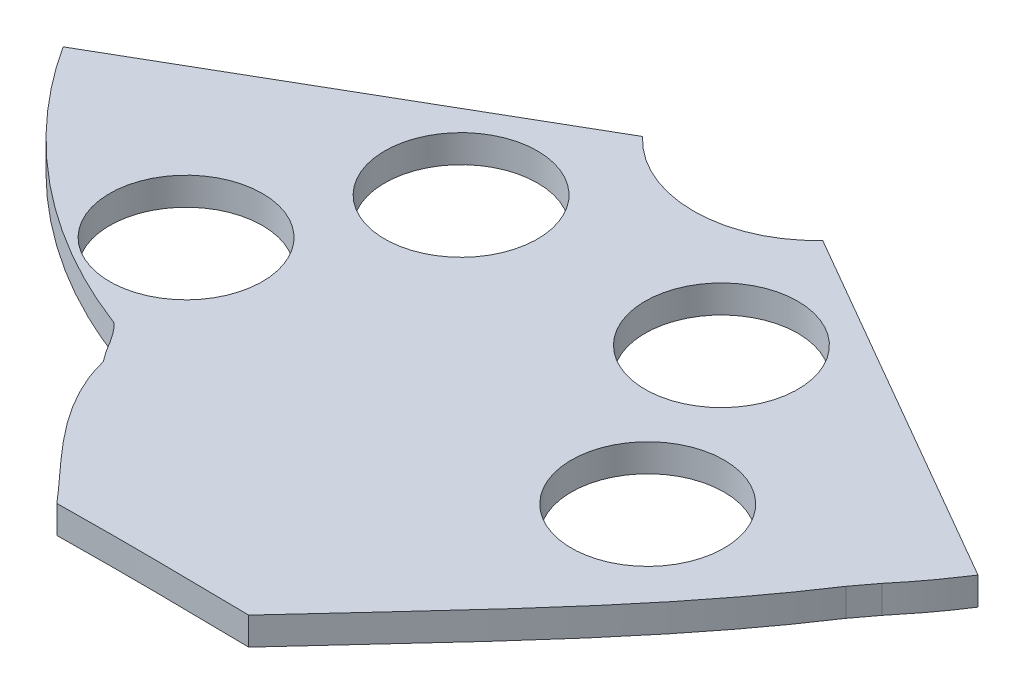
ISO-10303-21;
HEADER;
FILE_DESCRIPTION(('STEP AP214'),'2;1');
FILE_NAME('part.step','',(''),(''),'','','');
FILE_SCHEMA(('AUTOMOTIVE_DESIGN { 1 0 10303 214 1 1 1 1 }'));
ENDSEC;
DATA;
#1=APPLICATION_CONTEXT('core data for automotive mechanical design processes');
#2=APPLICATION_PROTOCOL_DEFINITION('international standard','automotive_design',2000,#1);
#3=PRODUCT_CONTEXT('',#1,'mechanical');
#4=PRODUCT('Part','Part','',(#3));
#5=PRODUCT_RELATED_PRODUCT_CATEGORY('part','',(#4));
#6=PRODUCT_DEFINITION_FORMATION('','',#4);
#7=PRODUCT_DEFINITION_CONTEXT('part definition',#1,'design');
#8=PRODUCT_DEFINITION('design','',#6,#7);
#9=PRODUCT_DEFINITION_SHAPE('','',#8);
#10=(LENGTH_UNIT() NAMED_UNIT(*) SI_UNIT(.MILLI.,.METRE.));
#11=(NAMED_UNIT(*) PLANE_ANGLE_UNIT() SI_UNIT($,.RADIAN.));
#12=(NAMED_UNIT(*) SI_UNIT($,.STERADIAN.) SOLID_ANGLE_UNIT());
#13=UNCERTAINTY_MEASURE_WITH_UNIT(LENGTH_MEASURE(1.E-05),#10,'distance_accuracy_value','');
#14=(GEOMETRIC_REPRESENTATION_CONTEXT(3) GLOBAL_UNCERTAINTY_ASSIGNED_CONTEXT((#13)) GLOBAL_UNIT_ASSIGNED_CONTEXT((#10,
#11,#12)) REPRESENTATION_CONTEXT('',''));
#15=CARTESIAN_POINT('',(0.,0.,0.));
#16=DIRECTION('',(0.,0.,1.));
#17=DIRECTION('',(1.,0.,0.));
#18=AXIS2_PLACEMENT_3D('',#15,#16,#17);
#19=CARTESIAN_POINT('',(-49.3251559306499,-75.736,61.0681336845495));
#20=DIRECTION('',(0.,-1.,0.));
#21=DIRECTION('',(0.,0.,-1.));
#22=AXIS2_PLACEMENT_3D('',#19,#20,#21);
#23=PLANE('',#22);
#24=CARTESIAN_POINT('',(18.75,-75.736,32.476));
#25=DIRECTION('',(0.,-1.,0.));
#26=DIRECTION('',(0.,0.,-1.));
#27=AXIS2_PLACEMENT_3D('',#24,#25,#26);
#28=CIRCLE('',#27,10.999845998306);
#29=CARTESIAN_POINT('',(18.75,-75.736,21.476154001694));
#30=VERTEX_POINT('',#29);
#31=EDGE_CURVE('E441',#30,#30,#28,.T.);
#32=ORIENTED_EDGE('',*,*,#31,.F.);
#33=EDGE_LOOP('',(#32));
#34=FACE_BOUND('',#33,.T.);
#35=CARTESIAN_POINT('',(-33.25,-75.736,57.591));
#36=DIRECTION('',(0.,-1.,0.));
#37=DIRECTION('',(0.,0.,-1.));
#38=AXIS2_PLACEMENT_3D('',#35,#36,#37);
#39=CIRCLE('',#38,10.999845998306);
#40=CARTESIAN_POINT('',(-33.25,-75.736,46.591154001694));
#41=VERTEX_POINT('',#40);
#42=EDGE_CURVE('E422',#41,#41,#39,.T.);
#43=ORIENTED_EDGE('',*,*,#42,.F.);
#44=EDGE_LOOP('',(#43));
#45=FACE_BOUND('',#44,.T.);
#46=CARTESIAN_POINT('',(-65.8942438215736,-75.736,42.6629141284688));
#47=CARTESIAN_POINT('',(-64.767422520505,-75.736,44.4027044600755));
#48=CARTESIAN_POINT('',(-63.5718643621077,-75.736,46.0988940940524));
#49=CARTESIAN_POINT('',(-61.0521689051536,-75.736,49.3887324797404));
#50=CARTESIAN_POINT('',(-59.727008374736,-75.736,50.9829329409589));
#51=CARTESIAN_POINT('',(-55.5665444443822,-75.736,55.6031367626288));
#52=CARTESIAN_POINT('',(-52.5489505867435,-75.736,58.464282038792));
#53=CARTESIAN_POINT('',(-46.1013612745563,-75.736,63.6719853303069));
#54=CARTESIAN_POINT('',(-42.6694563621279,-75.736,66.0207583018738));
#55=CARTESIAN_POINT('',(-35.4806077264138,-75.736,70.1471588010179));
#56=CARTESIAN_POINT('',(-31.7213398313859,-75.736,71.9243112594398));
#57=CARTESIAN_POINT('',(-27.8465665988509,-75.736,73.3950244209968));
#58=B_SPLINE_CURVE_WITH_KNOTS('',3,(#46,#47,#48,#49,#50,#51,#52,#53,#54,#55,#56,#57),
.UNSPECIFIED.,.F.,.F.,(4,2,2,2,2,4),(1.37053743953786E-06,0.12500137053744,0.25000137053744,
0.50000137053744,0.75000137053744,1.),.UNSPECIFIED.);
#59=CARTESIAN_POINT('',(-27.8465665942544,-75.736,73.3950244088874));
#60=VERTEX_POINT('',#59);
#61=CARTESIAN_POINT('',(-65.8942438215736,-75.736,42.6629141284688));
#62=VERTEX_POINT('',#61);
#63=EDGE_CURVE('E378',#60,#62,#58,.F.);
#64=ORIENTED_EDGE('',*,*,#63,.T.);
#65=DIRECTION('',(0.866025113443952,0.,-0.500000502884138));
#66=VECTOR('',#65,1.);
#67=CARTESIAN_POINT('',(-65.8942438215736,-75.736,42.6629141284688));
#68=LINE('',#67,#66);
#69=CARTESIAN_POINT('',(-12.9766531358799,-75.736,12.1108879302399));
#70=VERTEX_POINT('',#69);
#71=EDGE_CURVE('E103',#62,#70,#68,.T.);
#72=ORIENTED_EDGE('',*,*,#71,.T.);
#73=CARTESIAN_POINT('',(0.,-75.736,0.));
#74=DIRECTION('',(0.,1.,0.));
#75=DIRECTION('',(0.,0.,-1.));
#76=AXIS2_PLACEMENT_3D('',#73,#74,#75);
#77=CIRCLE('',#76,17.7501305084715);
#78=CARTESIAN_POINT('',(12.9766531358511,-75.736,12.1108879302707));
#79=VERTEX_POINT('',#78);
#80=EDGE_CURVE('E272',#70,#79,#77,.T.);
#81=ORIENTED_EDGE('',*,*,#80,.T.);
#82=DIRECTION('',(0.866025113442763,0.,0.500000502886197));
#83=VECTOR('',#82,1.);
#84=CARTESIAN_POINT('',(12.9766531358511,-75.736,12.1108879302707));
#85=LINE('',#84,#83);
#86=CARTESIAN_POINT('',(65.8946490574716,-75.736,42.6631480920526));
#87=VERTEX_POINT('',#86);
#88=EDGE_CURVE('E249',#79,#87,#85,.T.);
#89=ORIENTED_EDGE('',*,*,#88,.T.);
#90=CARTESIAN_POINT('',(60.0082608483995,-75.736,50.610266989157));
#91=CARTESIAN_POINT('',(62.1345077852679,-75.736,48.088878155953));
#92=CARTESIAN_POINT('',(64.1019109835356,-75.736,45.4323363272927));
#93=CARTESIAN_POINT('',(65.8946490574716,-75.736,42.6631480920526));
#94=B_SPLINE_CURVE_WITH_KNOTS('',3,(#90,#91,#92,#93),.UNSPECIFIED.,.F.,.F.,(4,4),
(-7.26602359391038E-08,0.999999999999405),.UNSPECIFIED.);
#95=CARTESIAN_POINT('',(60.0082608483995,-75.736,50.610266989157));
#96=VERTEX_POINT('',#95);
#97=EDGE_CURVE('E244',#87,#96,#94,.F.);
#98=ORIENTED_EDGE('',*,*,#97,.T.);
#99=CARTESIAN_POINT('',(57.77646162295,-75.736,53.5804706731537));
#100=CARTESIAN_POINT('',(58.1505851413669,-75.736,53.0825394147541));
#101=CARTESIAN_POINT('',(58.8944927412424,-75.736,52.0924523780649));
#102=CARTESIAN_POINT('',(59.6384513916341,-75.736,51.1024037005383));
#103=CARTESIAN_POINT('',(60.0082608483995,-75.736,50.610266989157));
#104=B_SPLINE_CURVE_WITH_KNOTS('',3,(#99,#100,#101,#102,#103),.UNSPECIFIED.,.F.,.F.,(4,1,4),(0.,
0.502895989813928,0.999958915434715),.UNSPECIFIED.);
#105=CARTESIAN_POINT('',(57.77646162295,-75.736,53.5804706731537));
#106=VERTEX_POINT('',#105);
#107=EDGE_CURVE('E321',#96,#106,#104,.F.);
#108=ORIENTED_EDGE('',*,*,#107,.T.);
#109=CARTESIAN_POINT('',(18.3639888109196,-75.736,100.181519669883));
#110=CARTESIAN_POINT('',(19.0218710512438,-75.736,99.4666766220116));
#111=CARTESIAN_POINT('',(20.3447419938496,-75.736,98.0292687721094));
#112=CARTESIAN_POINT('',(22.9723423305663,-75.736,95.1814899032558));
#113=CARTESIAN_POINT('',(26.2478109736766,-75.736,91.6391406773124));
#114=CARTESIAN_POINT('',(30.1581030421812,-75.736,87.4044415463974));
#115=CARTESIAN_POINT('',(34.050871462061,-75.736,83.1539013262244));
#116=CARTESIAN_POINT('',(37.265990329738,-75.736,79.5860836370363));
#117=CARTESIAN_POINT('',(39.8104951030775,-75.736,76.7082785793264));
#118=CARTESIAN_POINT('',(42.332313821998,-75.736,73.8125907991756));
#119=CARTESIAN_POINT('',(45.4365804853463,-75.736,70.1521822998598));
#120=CARTESIAN_POINT('',(48.4707034808431,-75.736,66.4052615754971));
#121=CARTESIAN_POINT('',(50.8243300318622,-75.736,63.3702880618992));
#122=CARTESIAN_POINT('',(52.5712439929802,-75.736,61.0470877162743));
#123=CARTESIAN_POINT('',(54.2541647603032,-75.736,58.7329972188304));
#124=CARTESIAN_POINT('',(55.5770436646888,-75.736,56.8475916096867));
#125=CARTESIAN_POINT('',(56.5320135329237,-75.736,55.4491505245088));
#126=CARTESIAN_POINT('',(57.1616371510202,-75.736,54.5134013691721));
#127=CARTESIAN_POINT('',(57.5724895917968,-75.736,53.8899763360344));
#128=CARTESIAN_POINT('',(57.77646162295,-75.736,53.5804706731537));
#129=B_SPLINE_CURVE_WITH_KNOTS('',3,(#109,#110,#111,#112,#113,#114,#115,#116,#117,#118,#119,
#120,#121,#122,#123,#124,#125,#126,#127,#128),.UNSPECIFIED.,.F.,.F.,(4,1,1,1,1,1,1,1,1,1,1,1,1,
1,1,1,1,4),(-1.56541117701803E-06,0.0476944208933406,0.095905620546706,0.190233076197312,
0.284560357346075,0.378887834981831,0.473204321306662,0.520347416933958,0.567480259245344,
0.661722178668166,0.7559639979035,0.804156992593871,0.850273860159286,0.898664281163223,
0.944628569271974,0.963344097828945,0.9818018016999,0.999999999995495),.UNSPECIFIED.);
#130=CARTESIAN_POINT('',(18.3639888109196,-75.736,100.181519669883));
#131=VERTEX_POINT('',#130);
#132=EDGE_CURVE('E129',#106,#131,#129,.F.);
#133=ORIENTED_EDGE('',*,*,#132,.T.);
#134=CARTESIAN_POINT('',(18.3639888107332,-75.736,100.181519670098));
#135=CARTESIAN_POINT('',(12.464093875306,-75.736,100.105668079599));
#136=CARTESIAN_POINT('',(3.30260106505934,-75.736,99.9448318102376));
#137=CARTESIAN_POINT('',(-6.23902534430648,-75.736,100.028697438345));
#138=CARTESIAN_POINT('',(-9.3894886138542,-75.736,100.065964336462));
#139=B_SPLINE_CURVE_WITH_KNOTS('',3,(#134,#135,#136,#137,#138),.UNSPECIFIED.,.F.,.F.,(4,1,4),
(8.06164428963621E-06,0.670908974433594,1.00000134150822),.UNSPECIFIED.);
#140=CARTESIAN_POINT('',(-9.38948861385419,-75.736,100.065964336462));
#141=VERTEX_POINT('',#140);
#142=EDGE_CURVE('E122',#131,#141,#139,.T.);
#143=ORIENTED_EDGE('',*,*,#142,.T.);
#144=CARTESIAN_POINT('',(-23.7310102952198,-75.736,79.0132757787941));
#145=CARTESIAN_POINT('',(-23.7030494309236,-75.736,79.1294226429668));
#146=CARTESIAN_POINT('',(-23.6468345768955,-75.736,79.3629358678116));
#147=CARTESIAN_POINT('',(-23.4847623928394,-75.736,79.9738100945838));
#148=CARTESIAN_POINT('',(-23.2159592589615,-75.736,80.8559194256731));
#149=CARTESIAN_POINT('',(-22.6669872102959,-75.736,82.3616735285191));
#150=CARTESIAN_POINT('',(-21.8427107853222,-75.736,84.1943891446218));
#151=CARTESIAN_POINT('',(-20.6868610264777,-75.736,86.2929743903318));
#152=CARTESIAN_POINT('',(-19.3903836837775,-75.736,88.3049758436249));
#153=CARTESIAN_POINT('',(-17.9754588326445,-75.736,90.2405324889424));
#154=CARTESIAN_POINT('',(-16.4684677287123,-75.736,92.1099101383163));
#155=CARTESIAN_POINT('',(-14.8963628242238,-75.736,93.9259845710743));
#156=CARTESIAN_POINT('',(-13.2850891923101,-75.736,95.7065645852527));
#157=CARTESIAN_POINT('',(-11.9257094669822,-75.736,97.1888659916863));
#158=CARTESIAN_POINT('',(-10.8537241176303,-75.736,98.3779527002122));
#159=CARTESIAN_POINT('',(-10.2080241470578,-75.736,99.109904429284));
#160=CARTESIAN_POINT('',(-9.72559079243196,-75.736,99.6686207720841));
#161=CARTESIAN_POINT('',(-9.50082548013622,-75.736,99.9343407058414));
#162=CARTESIAN_POINT('',(-9.3894886100982,-75.736,100.065964333285));
#163=B_SPLINE_CURVE_WITH_KNOTS('',3,(#144,#145,#146,#147,#148,#149,#150,#151,#152,#153,#154,
#155,#156,#157,#158,#159,#160,#161,#162),.UNSPECIFIED.,.F.,.F.,(4,1,1,1,1,1,1,1,1,1,1,1,1,1,1,1,
4),(-2.31314523091442E-10,0.0139155033250553,0.0279771013445159,0.073615180851422,
0.121273538553654,0.214594292993594,0.307355473508571,0.400112247350512,0.493213641601676,
0.586508506069887,0.679734933650055,0.772975239603515,0.866227617244255,0.914016518964076,
0.959461736006876,0.979920604032934,1.00000221923363),.UNSPECIFIED.);
#164=CARTESIAN_POINT('',(-23.7310102952198,-75.736,79.0132757787941));
#165=VERTEX_POINT('',#164);
#166=EDGE_CURVE('E126',#141,#165,#163,.F.);
#167=ORIENTED_EDGE('',*,*,#166,.T.);
#168=CARTESIAN_POINT('',(-27.8465665942544,-75.736,73.3950244088874));
#169=CARTESIAN_POINT('',(-27.78757259099,-75.736,73.4485675842633));
#170=CARTESIAN_POINT('',(-27.6739803703089,-75.736,73.551664303535));
#171=CARTESIAN_POINT('',(-27.472656548617,-75.736,73.7459167397777));
#172=CARTESIAN_POINT('',(-27.1283292069127,-75.736,74.0997490473876));
#173=CARTESIAN_POINT('',(-26.6656921396563,-75.736,74.644570756122));
#174=CARTESIAN_POINT('',(-26.151079314133,-75.736,75.3622426191954));
#175=CARTESIAN_POINT('',(-25.67746974416,-75.736,76.1095570293913));
#176=CARTESIAN_POINT('',(-25.221305377054,-75.736,76.8695203696533));
#177=CARTESIAN_POINT('',(-24.7564452816665,-75.736,77.6246288904114));
#178=CARTESIAN_POINT('',(-24.3416420767229,-75.736,78.23631930852));
#179=CARTESIAN_POINT('',(-24.0364827850307,-75.736,78.6393847281269));
#180=CARTESIAN_POINT('',(-23.8612098700755,-75.736,78.8579828507243));
#181=CARTESIAN_POINT('',(-23.7760370912526,-75.736,78.9595713250933));
#182=CARTESIAN_POINT('',(-23.7310102952202,-75.7359999999999,79.0132757787944));
#183=B_SPLINE_CURVE_WITH_KNOTS('',3,(#168,#169,#170,#171,#172,#173,#174,#175,#176,#177,#178,
#179,#180,#181,#182),.UNSPECIFIED.,.F.,.F.,(4,1,1,1,1,1,1,1,1,1,1,1,4),(1.28704978621386E-05,
0.0342187503290116,0.0658758673343319,0.120116996873744,0.246160344636145,0.372304374545473,
0.498999327729837,0.625945021971855,0.7528908808338,0.879702579735347,0.943080123926213,
0.969909348429355,1.),.UNSPECIFIED.);
#184=EDGE_CURVE('E51',#165,#60,#183,.F.);
#185=ORIENTED_EDGE('',*,*,#184,.T.);
#186=EDGE_LOOP('',(#64,#72,#81,#89,#98,#108,#133,#143,#167,#185));
#187=FACE_BOUND('',#186,.T.);
#188=CARTESIAN_POINT('',(33.25,-75.736,57.591));
#189=DIRECTION('',(0.,-1.,0.));
#190=DIRECTION('',(0.,0.,-1.));
#191=AXIS2_PLACEMENT_3D('',#188,#189,#190);
#192=CIRCLE('',#191,10.999845998306);
#193=CARTESIAN_POINT('',(33.25,-75.736,46.591154001694));
#194=VERTEX_POINT('',#193);
#195=EDGE_CURVE('E429',#194,#194,#192,.T.);
#196=ORIENTED_EDGE('',*,*,#195,.F.);
#197=EDGE_LOOP('',(#196));
#198=FACE_BOUND('',#197,.T.);
#199=CARTESIAN_POINT('',(-18.75,-75.736,32.476));
#200=DIRECTION('',(0.,-1.,0.));
#201=DIRECTION('',(0.,0.,-1.));
#202=AXIS2_PLACEMENT_3D('',#199,#200,#201);
#203=CIRCLE('',#202,10.999845998306);
#204=CARTESIAN_POINT('',(-18.75,-75.736,21.476154001694));
#205=VERTEX_POINT('',#204);
#206=EDGE_CURVE('E447',#205,#205,#203,.T.);
#207=ORIENTED_EDGE('',*,*,#206,.F.);
#208=EDGE_LOOP('',(#207));
#209=FACE_BOUND('',#208,.T.);
#210=ADVANCED_FACE('F30',(#34,#45,#187,#198,#209),#23,.T.);
#211=CARTESIAN_POINT('',(-49.3251559306499,-71.7359999999999,61.0681336845495));
#212=DIRECTION('',(0.,-1.,0.));
#213=DIRECTION('',(0.,0.,-1.));
#214=AXIS2_PLACEMENT_3D('',#211,#212,#213);
#215=PLANE('',#214);
#216=CARTESIAN_POINT('',(18.75,-71.7359999999999,32.476));
#217=DIRECTION('',(0.,-1.,0.));
#218=DIRECTION('',(0.,0.,-1.));
#219=AXIS2_PLACEMENT_3D('',#216,#217,#218);
#220=CIRCLE('',#219,10.999845998306);
#221=CARTESIAN_POINT('',(18.75,-71.7359999999999,21.476154001694));
#222=VERTEX_POINT('',#221);
#223=EDGE_CURVE('E444',#222,#222,#220,.T.);
#224=ORIENTED_EDGE('',*,*,#223,.T.);
#225=EDGE_LOOP('',(#224));
#226=FACE_BOUND('',#225,.T.);
#227=CARTESIAN_POINT('',(-33.25,-71.7359999999999,57.591));
#228=DIRECTION('',(0.,-1.,0.));
#229=DIRECTION('',(0.,0.,-1.));
#230=AXIS2_PLACEMENT_3D('',#227,#228,#229);
#231=CIRCLE('',#230,10.999845998306);
#232=CARTESIAN_POINT('',(-33.25,-71.7359999999999,46.591154001694));
#233=VERTEX_POINT('',#232);
#234=EDGE_CURVE('E424',#233,#233,#231,.T.);
#235=ORIENTED_EDGE('',*,*,#234,.T.);
#236=EDGE_LOOP('',(#235));
#237=FACE_BOUND('',#236,.T.);
#238=CARTESIAN_POINT('',(-27.8465665988509,-71.7359999999999,73.3950244209968));
#239=CARTESIAN_POINT('',(-31.7213398313859,-71.7359999999999,71.9243112594398));
#240=CARTESIAN_POINT('',(-35.4806077264138,-71.7359999999999,70.1471588010179));
#241=CARTESIAN_POINT('',(-42.6694563621279,-71.7359999999999,66.0207583018738));
#242=CARTESIAN_POINT('',(-46.1013612745563,-71.7359999999999,63.6719853303069));
#243=CARTESIAN_POINT('',(-52.5489505867435,-71.7359999999999,58.464282038792));
#244=CARTESIAN_POINT('',(-55.5665444443822,-71.7359999999999,55.6031367626288));
#245=CARTESIAN_POINT('',(-59.727008374736,-71.7359999999999,50.9829329409589));
#246=CARTESIAN_POINT('',(-61.0521689051536,-71.7359999999999,49.3887324797404));
#247=CARTESIAN_POINT('',(-63.5718643621077,-71.7359999999999,46.0988940940524));
#248=CARTESIAN_POINT('',(-64.767422520505,-71.7359999999999,44.4027044600755));
#249=CARTESIAN_POINT('',(-65.8942438215736,-71.7359999999999,42.6629141284688));
#250=B_SPLINE_CURVE_WITH_KNOTS('',3,(#238,#239,#240,#241,#242,#243,#244,#245,#246,#247,#248,
#249),.UNSPECIFIED.,.F.,.F.,(4,2,2,2,2,4),(1.37053743955936E-06,0.25,0.5,0.75,0.875,1.),.UNSPECIFIED.);
#251=CARTESIAN_POINT('',(-27.8465665942544,-71.7359999999999,73.3950244088874));
#252=VERTEX_POINT('',#251);
#253=CARTESIAN_POINT('',(-65.8942438215736,-71.7359999999999,42.6629141284688));
#254=VERTEX_POINT('',#253);
#255=EDGE_CURVE('E405',#252,#254,#250,.T.);
#256=ORIENTED_EDGE('',*,*,#255,.F.);
#257=CARTESIAN_POINT('',(-23.7310102952202,-71.7359999999996,79.0132757787944));
#258=CARTESIAN_POINT('',(-23.7760370912526,-71.7359999999997,78.9595713250933));
#259=CARTESIAN_POINT('',(-23.8612098700755,-71.7359999999997,78.8579828507243));
#260=CARTESIAN_POINT('',(-24.0364827850307,-71.7359999999997,78.6393847281269));
#261=CARTESIAN_POINT('',(-24.3416420767229,-71.7359999999997,78.23631930852));
#262=CARTESIAN_POINT('',(-24.7564452816665,-71.7359999999997,77.6246288904114));
#263=CARTESIAN_POINT('',(-25.221305377054,-71.7359999999997,76.8695203696533));
#264=CARTESIAN_POINT('',(-25.67746974416,-71.7359999999997,76.1095570293913));
#265=CARTESIAN_POINT('',(-26.151079314133,-71.7359999999997,75.3622426191954));
#266=CARTESIAN_POINT('',(-26.6656921396563,-71.7359999999997,74.644570756122));
#267=CARTESIAN_POINT('',(-27.1283292069127,-71.7359999999997,74.0997490473876));
#268=CARTESIAN_POINT('',(-27.472656548617,-71.7359999999997,73.7459167397777));
#269=CARTESIAN_POINT('',(-27.6739803703089,-71.7359999999997,73.551664303535));
#270=CARTESIAN_POINT('',(-27.78757259099,-71.7359999999997,73.4485675842633));
#271=CARTESIAN_POINT('',(-27.8465665942544,-71.7359999999997,73.3950244088874));
#272=B_SPLINE_CURVE_WITH_KNOTS('',3,(#257,#258,#259,#260,#261,#262,#263,#264,#265,#266,#267,
#268,#269,#270,#271),.UNSPECIFIED.,.F.,.F.,(4,1,1,1,1,1,1,1,1,1,1,1,4),(1.28704978621883E-05,
0.0301035220685071,0.0569327465716487,0.120310290762515,0.247121989664063,0.374067848526007,
0.501013542768025,0.627708495952389,0.753852525861717,0.879895873624118,0.93413700316353,
0.965794120168851,1.),.UNSPECIFIED.);
#273=CARTESIAN_POINT('',(-23.7310102952198,-71.736,79.0132757787941));
#274=VERTEX_POINT('',#273);
#275=EDGE_CURVE('E94',#274,#252,#272,.T.);
#276=ORIENTED_EDGE('',*,*,#275,.F.);
#277=CARTESIAN_POINT('',(-9.3894886100982,-71.7359999999999,100.065964333285));
#278=CARTESIAN_POINT('',(-9.50082548013622,-71.7359999999999,99.9343407058414));
#279=CARTESIAN_POINT('',(-9.72559079243196,-71.7359999999999,99.6686207720841));
#280=CARTESIAN_POINT('',(-10.2080241470578,-71.7359999999999,99.109904429284));
#281=CARTESIAN_POINT('',(-10.8537241176303,-71.7359999999999,98.3779527002122));
#282=CARTESIAN_POINT('',(-11.9257094669822,-71.7359999999999,97.1888659916863));
#283=CARTESIAN_POINT('',(-13.2850891923101,-71.7359999999999,95.7065645852527));
#284=CARTESIAN_POINT('',(-14.8963628242238,-71.7359999999999,93.9259845710743));
#285=CARTESIAN_POINT('',(-16.4684677287123,-71.7359999999999,92.1099101383163));
#286=CARTESIAN_POINT('',(-17.9754588326445,-71.7359999999999,90.2405324889424));
#287=CARTESIAN_POINT('',(-19.3903836837775,-71.7359999999999,88.3049758436249));
#288=CARTESIAN_POINT('',(-20.6868610264777,-71.7359999999999,86.2929743903318));
#289=CARTESIAN_POINT('',(-21.8427107853222,-71.7359999999999,84.1943891446218));
#290=CARTESIAN_POINT('',(-22.6669872102959,-71.7359999999999,82.3616735285191));
#291=CARTESIAN_POINT('',(-23.2159592589615,-71.7359999999999,80.8559194256731));
#292=CARTESIAN_POINT('',(-23.4847623928394,-71.7359999999999,79.9738100945838));
#293=CARTESIAN_POINT('',(-23.6468345768955,-71.7359999999999,79.3629358678116));
#294=CARTESIAN_POINT('',(-23.7030494309236,-71.7359999999999,79.1294226429668));
#295=CARTESIAN_POINT('',(-23.7310102952198,-71.736,79.0132757787941));
#296=B_SPLINE_CURVE_WITH_KNOTS('',3,(#277,#278,#279,#280,#281,#282,#283,#284,#285,#286,#287,
#288,#289,#290,#291,#292,#293,#294,#295),.UNSPECIFIED.,.F.,.F.,(4,1,1,1,1,1,1,1,1,1,1,1,1,1,1,1,
4),(-2.31314580161133E-10,0.0200816149693828,0.040540482995441,0.0859857000382408,
0.133774601758062,0.227026979398802,0.320267285352262,0.41349371293243,0.506788577400642,
0.599889971651805,0.692646745493746,0.785407926008723,0.878728680448663,0.926387038150895,
0.972025117657801,0.986086715677262,1.00000221923363),.UNSPECIFIED.);
#297=CARTESIAN_POINT('',(-9.38948861385419,-71.7359999999999,100.065964336462));
#298=VERTEX_POINT('',#297);
#299=EDGE_CURVE('E87',#298,#274,#296,.T.);
#300=ORIENTED_EDGE('',*,*,#299,.F.);
#301=CARTESIAN_POINT('',(18.3639888107332,-71.7359999999999,100.181519670098));
#302=CARTESIAN_POINT('',(12.464093875306,-71.7359999999999,100.105668079599));
#303=CARTESIAN_POINT('',(3.30260106505934,-71.7359999999999,99.9448318102376));
#304=CARTESIAN_POINT('',(-6.23902534430648,-71.7359999999999,100.028697438345));
#305=CARTESIAN_POINT('',(-9.3894886138542,-71.7359999999999,100.065964336462));
#306=B_SPLINE_CURVE_WITH_KNOTS('',3,(#301,#302,#303,#304,#305),.UNSPECIFIED.,.F.,.F.,(4,1,4),
(8.06164428963621E-06,0.670908974433594,1.00000134150822),.UNSPECIFIED.);
#307=CARTESIAN_POINT('',(18.3639888109196,-71.7359999999999,100.181519669883));
#308=VERTEX_POINT('',#307);
#309=EDGE_CURVE('E138',#308,#298,#306,.T.);
#310=ORIENTED_EDGE('',*,*,#309,.F.);
#311=CARTESIAN_POINT('',(57.77646162295,-71.7359999999999,53.5804706731537));
#312=CARTESIAN_POINT('',(57.5724895917968,-71.7359999999999,53.8899763360344));
#313=CARTESIAN_POINT('',(57.1616371510202,-71.7359999999999,54.5134013691721));
#314=CARTESIAN_POINT('',(56.5320135329237,-71.7359999999999,55.4491505245088));
#315=CARTESIAN_POINT('',(55.5770436646888,-71.7359999999999,56.8475916096867));
#316=CARTESIAN_POINT('',(54.2541647603032,-71.7359999999999,58.7329972188304));
#317=CARTESIAN_POINT('',(52.5712439929802,-71.7359999999999,61.0470877162743));
#318=CARTESIAN_POINT('',(50.8243300318622,-71.7359999999999,63.3702880618992));
#319=CARTESIAN_POINT('',(48.4707034808431,-71.7359999999999,66.4052615754971));
#320=CARTESIAN_POINT('',(45.4365804853463,-71.7359999999999,70.1521822998598));
#321=CARTESIAN_POINT('',(42.332313821998,-71.7359999999999,73.8125907991756));
#322=CARTESIAN_POINT('',(39.8104951030775,-71.7359999999999,76.7082785793264));
#323=CARTESIAN_POINT('',(37.265990329738,-71.7359999999999,79.5860836370363));
#324=CARTESIAN_POINT('',(34.050871462061,-71.7359999999999,83.1539013262244));
#325=CARTESIAN_POINT('',(30.1581030421812,-71.7359999999999,87.4044415463974));
#326=CARTESIAN_POINT('',(26.2478109736766,-71.7359999999999,91.6391406773124));
#327=CARTESIAN_POINT('',(22.9723423305663,-71.7359999999999,95.1814899032558));
#328=CARTESIAN_POINT('',(20.3447419938496,-71.7359999999999,98.0292687721094));
#329=CARTESIAN_POINT('',(19.0218710512438,-71.736,99.4666766220116));
#330=CARTESIAN_POINT('',(18.3639888109196,-71.736,100.181519669883));
#331=B_SPLINE_CURVE_WITH_KNOTS('',3,(#311,#312,#313,#314,#315,#316,#317,#318,#319,#320,#321,
#322,#323,#324,#325,#326,#327,#328,#329,#330),.UNSPECIFIED.,.F.,.F.,(4,1,1,1,1,1,1,1,1,1,1,1,1,
1,1,1,1,4),(-1.56541117699857E-06,0.0181966328844179,0.0366543367553735,0.055369865312344,
0.101334153421095,0.149724574425032,0.195841441990448,0.244034436680818,0.338276255916153,
0.432518175338974,0.47965101765036,0.526794113277656,0.621110599602487,0.715438077238243,
0.809765358387006,0.904092814037612,0.952304013690978,0.999999999995495),.UNSPECIFIED.);
#332=CARTESIAN_POINT('',(57.77646162295,-71.7359999999999,53.5804706731537));
#333=VERTEX_POINT('',#332);
#334=EDGE_CURVE('E312',#333,#308,#331,.T.);
#335=ORIENTED_EDGE('',*,*,#334,.F.);
#336=CARTESIAN_POINT('',(60.0082608483995,-71.7359999999999,50.610266989157));
#337=CARTESIAN_POINT('',(59.6384513916341,-71.7359999999999,51.1024037005383));
#338=CARTESIAN_POINT('',(58.8944927412424,-71.7359999999999,52.0924523780649));
#339=CARTESIAN_POINT('',(58.1505851413669,-71.7359999999999,53.0825394147541));
#340=CARTESIAN_POINT('',(57.77646162295,-71.7359999999999,53.5804706731537));
#341=B_SPLINE_CURVE_WITH_KNOTS('',3,(#336,#337,#338,#339,#340),.UNSPECIFIED.,.F.,.F.,(4,1,4),
(0.,0.497062925620787,0.999958915434715),.UNSPECIFIED.);
#342=CARTESIAN_POINT('',(60.0082608483995,-71.7359999999999,50.610266989157));
#343=VERTEX_POINT('',#342);
#344=EDGE_CURVE('E327',#343,#333,#341,.T.);
#345=ORIENTED_EDGE('',*,*,#344,.F.);
#346=CARTESIAN_POINT('',(65.8946490574716,-71.7359999999999,42.6631480920526));
#347=CARTESIAN_POINT('',(64.1019109835356,-71.7359999999999,45.4323363272927));
#348=CARTESIAN_POINT('',(62.1345077852679,-71.7359999999999,48.088878155953));
#349=CARTESIAN_POINT('',(60.0082608483995,-71.7359999999999,50.610266989157));
#350=B_SPLINE_CURVE_WITH_KNOTS('',3,(#346,#347,#348,#349),.UNSPECIFIED.,.F.,.F.,(4,4),
(-7.2660235916377E-08,0.999999999999405),.UNSPECIFIED.);
#351=CARTESIAN_POINT('',(65.8946490574716,-71.7359999999999,42.6631480920526));
#352=VERTEX_POINT('',#351);
#353=EDGE_CURVE('E363',#352,#343,#350,.T.);
#354=ORIENTED_EDGE('',*,*,#353,.F.);
#355=DIRECTION('',(0.866025113442763,0.,0.500000502886197));
#356=VECTOR('',#355,1.);
#357=CARTESIAN_POINT('',(12.9766531358511,-71.7359999999999,12.1108879302707));
#358=LINE('',#357,#356);
#359=CARTESIAN_POINT('',(12.9766531358511,-71.7359999999999,12.1108879302707));
#360=VERTEX_POINT('',#359);
#361=EDGE_CURVE('E188',#360,#352,#358,.T.);
#362=ORIENTED_EDGE('',*,*,#361,.F.);
#363=CARTESIAN_POINT('',(0.,-71.7359999999999,0.));
#364=DIRECTION('',(0.,1.,0.));
#365=DIRECTION('',(0.,0.,-1.));
#366=AXIS2_PLACEMENT_3D('',#363,#364,#365);
#367=CIRCLE('',#366,17.7501305084715);
#368=CARTESIAN_POINT('',(-12.9766531358799,-71.7359999999999,12.1108879302399));
#369=VERTEX_POINT('',#368);
#370=EDGE_CURVE('E183',#369,#360,#367,.T.);
#371=ORIENTED_EDGE('',*,*,#370,.F.);
#372=DIRECTION('',(0.866025113443952,0.,-0.500000502884138));
#373=VECTOR('',#372,1.);
#374=CARTESIAN_POINT('',(-65.8942438215736,-71.7359999999999,42.6629141284688));
#375=LINE('',#374,#373);
#376=EDGE_CURVE('E189',#254,#369,#375,.T.);
#377=ORIENTED_EDGE('',*,*,#376,.F.);
#378=EDGE_LOOP('',(#256,#276,#300,#310,#335,#345,#354,#362,#371,#377));
#379=FACE_BOUND('',#378,.T.);
#380=CARTESIAN_POINT('',(33.25,-71.7359999999999,57.591));
#381=DIRECTION('',(0.,-1.,0.));
#382=DIRECTION('',(0.,0.,-1.));
#383=AXIS2_PLACEMENT_3D('',#380,#381,#382);
#384=CIRCLE('',#383,10.999845998306);
#385=CARTESIAN_POINT('',(33.25,-71.7359999999999,46.591154001694));
#386=VERTEX_POINT('',#385);
#387=EDGE_CURVE('E432',#386,#386,#384,.T.);
#388=ORIENTED_EDGE('',*,*,#387,.T.);
#389=EDGE_LOOP('',(#388));
#390=FACE_BOUND('',#389,.T.);
#391=CARTESIAN_POINT('',(-18.75,-71.7359999999999,32.476));
#392=DIRECTION('',(0.,-1.,0.));
#393=DIRECTION('',(0.,0.,-1.));
#394=AXIS2_PLACEMENT_3D('',#391,#392,#393);
#395=CIRCLE('',#394,10.999845998306);
#396=CARTESIAN_POINT('',(-18.75,-71.7359999999999,21.476154001694));
#397=VERTEX_POINT('',#396);
#398=EDGE_CURVE('E450',#397,#397,#395,.T.);
#399=ORIENTED_EDGE('',*,*,#398,.T.);
#400=EDGE_LOOP('',(#399));
#401=FACE_BOUND('',#400,.T.);
#402=ADVANCED_FACE('F208',(#226,#237,#379,#390,#401),#215,.F.);
#403=CARTESIAN_POINT('',(-27.8465028722297,-75.736,73.3950486091112));
#404=CARTESIAN_POINT('',(-31.7212986134158,-75.736,71.9243307447699));
#405=CARTESIAN_POINT('',(-35.4805880211874,-75.736,70.1471701118217));
#406=CARTESIAN_POINT('',(-42.6694563621279,-75.736,66.0207583018738));
#407=CARTESIAN_POINT('',(-46.1013612745563,-75.736,63.6719853303069));
#408=CARTESIAN_POINT('',(-52.5489505867435,-75.736,58.464282038792));
#409=CARTESIAN_POINT('',(-55.5665444443822,-75.736,55.6031367626288));
#410=CARTESIAN_POINT('',(-59.727008374736,-75.736,50.9829329409589));
#411=CARTESIAN_POINT('',(-61.0521689051536,-75.736,49.3887324797404));
#412=CARTESIAN_POINT('',(-63.5718643621077,-75.736,46.0988940940524));
#413=CARTESIAN_POINT('',(-64.767422520505,-75.736,44.4027044600755));
#414=CARTESIAN_POINT('',(-65.8942438215736,-75.736,42.6629141284688));
#415=B_SPLINE_CURVE_WITH_KNOTS('',3,(#403,#404,#405,#406,#407,#408,#409,#410,#411,#412,#413,
#414),.UNSPECIFIED.,.F.,.F.,(4,2,2,2,2,4),(0.,0.25,0.5,0.75,0.875,1.),.UNSPECIFIED.);
#416=DIRECTION('',(0.,1.,0.));
#417=VECTOR('',#416,1.);
#418=SURFACE_OF_LINEAR_EXTRUSION('',#415,#417);
#419=ORIENTED_EDGE('',*,*,#255,.T.);
#420=DIRECTION('',(0.,1.,0.));
#421=VECTOR('',#420,1.);
#422=CARTESIAN_POINT('',(-65.8942438215736,-75.736,42.6629141284688));
#423=LINE('',#422,#421);
#424=EDGE_CURVE('E11',#62,#254,#423,.T.);
#425=ORIENTED_EDGE('',*,*,#424,.F.);
#426=ORIENTED_EDGE('',*,*,#63,.F.);
#427=DIRECTION('',(0.,1.,0.));
#428=VECTOR('',#427,1.);
#429=CARTESIAN_POINT('',(-27.8465665942544,-75.736,73.3950244088874));
#430=LINE('',#429,#428);
#431=EDGE_CURVE('E652',#60,#252,#430,.T.);
#432=ORIENTED_EDGE('',*,*,#431,.T.);
#433=EDGE_LOOP('',(#419,#425,#426,#432));
#434=FACE_BOUND('',#433,.T.);
#435=ADVANCED_FACE('F32',(#434),#418,.F.);
#436=CARTESIAN_POINT('',(-65.8942438215736,-75.736,42.6629141284688));
#437=DIRECTION('',(0.500000502884138,0.,0.866025113443952));
#438=DIRECTION('',(0.866025113443952,0.,-0.500000502884138));
#439=AXIS2_PLACEMENT_3D('',#436,#437,#438);
#440=PLANE('',#439);
#441=ORIENTED_EDGE('',*,*,#376,.T.);
#442=DIRECTION('',(0.,1.,0.));
#443=VECTOR('',#442,1.);
#444=CARTESIAN_POINT('',(-12.9766531358799,-75.736,12.1108879302399));
#445=LINE('',#444,#443);
#446=EDGE_CURVE('E42',#70,#369,#445,.T.);
#447=ORIENTED_EDGE('',*,*,#446,.F.);
#448=ORIENTED_EDGE('',*,*,#71,.F.);
#449=ORIENTED_EDGE('',*,*,#424,.T.);
#450=EDGE_LOOP('',(#441,#447,#448,#449));
#451=FACE_BOUND('',#450,.T.);
#452=ADVANCED_FACE('F469',(#451),#440,.F.);
#453=CARTESIAN_POINT('',(0.,-75.736,0.));
#454=DIRECTION('',(0.,1.,0.));
#455=DIRECTION('',(0.,0.,1.));
#456=AXIS2_PLACEMENT_3D('',#453,#454,#455);
#457=CYLINDRICAL_SURFACE('',#456,17.7501305084715);
#458=ORIENTED_EDGE('',*,*,#370,.T.);
#459=DIRECTION('',(0.,1.,0.));
#460=VECTOR('',#459,1.);
#461=CARTESIAN_POINT('',(12.9766531358511,-75.736,12.1108879302707));
#462=LINE('',#461,#460);
#463=EDGE_CURVE('E190',#79,#360,#462,.T.);
#464=ORIENTED_EDGE('',*,*,#463,.F.);
#465=ORIENTED_EDGE('',*,*,#80,.F.);
#466=ORIENTED_EDGE('',*,*,#446,.T.);
#467=EDGE_LOOP('',(#458,#464,#465,#466));
#468=FACE_BOUND('',#467,.T.);
#469=ADVANCED_FACE('F517',(#468),#457,.F.);
#470=CARTESIAN_POINT('',(12.9766531358511,-75.736,12.1108879302707));
#471=DIRECTION('',(-0.500000502886197,0.,0.866025113442763));
#472=DIRECTION('',(0.866025113442763,0.,0.500000502886197));
#473=AXIS2_PLACEMENT_3D('',#470,#471,#472);
#474=PLANE('',#473);
#475=ORIENTED_EDGE('',*,*,#361,.T.);
#476=DIRECTION('',(0.,1.,0.));
#477=VECTOR('',#476,1.);
#478=CARTESIAN_POINT('',(65.8946490574716,-75.736,42.6631480920526));
#479=LINE('',#478,#477);
#480=EDGE_CURVE('E193',#87,#352,#479,.T.);
#481=ORIENTED_EDGE('',*,*,#480,.F.);
#482=ORIENTED_EDGE('',*,*,#88,.F.);
#483=ORIENTED_EDGE('',*,*,#463,.T.);
#484=EDGE_LOOP('',(#475,#481,#482,#483));
#485=FACE_BOUND('',#484,.T.);
#486=ADVANCED_FACE('F263',(#485),#474,.F.);
#487=CARTESIAN_POINT('',(65.8946490574716,-75.736,42.6631480920526));
#488=CARTESIAN_POINT('',(64.1019109835356,-75.736,45.4323363272927));
#489=CARTESIAN_POINT('',(62.1345077852679,-75.736,48.088878155953));
#490=CARTESIAN_POINT('',(60.0082608483995,-75.736,50.610266989157));
#491=B_SPLINE_CURVE_WITH_KNOTS('',3,(#487,#488,#489,#490),.UNSPECIFIED.,.F.,.F.,(4,4),
(-7.2660235916377E-08,0.999999999999405),.UNSPECIFIED.);
#492=DIRECTION('',(0.,1.,0.));
#493=VECTOR('',#492,1.);
#494=SURFACE_OF_LINEAR_EXTRUSION('',#491,#493);
#495=ORIENTED_EDGE('',*,*,#353,.T.);
#496=DIRECTION('',(0.,1.,0.));
#497=VECTOR('',#496,1.);
#498=CARTESIAN_POINT('',(60.0082608483995,-75.736,50.610266989157));
#499=LINE('',#498,#497);
#500=EDGE_CURVE('E329',#96,#343,#499,.T.);
#501=ORIENTED_EDGE('',*,*,#500,.F.);
#502=ORIENTED_EDGE('',*,*,#97,.F.);
#503=ORIENTED_EDGE('',*,*,#480,.T.);
#504=EDGE_LOOP('',(#495,#501,#502,#503));
#505=FACE_BOUND('',#504,.T.);
#506=ADVANCED_FACE('F251',(#505),#494,.F.);
#507=CARTESIAN_POINT('',(60.0082608483995,-75.736,50.610266989157));
#508=CARTESIAN_POINT('',(59.6384513916341,-75.736,51.1024037005383));
#509=CARTESIAN_POINT('',(58.8944621747689,-75.736,52.0924930554556));
#510=CARTESIAN_POINT('',(58.1505240126149,-75.736,53.0826207726878));
#511=CARTESIAN_POINT('',(57.7763699298221,-75.736,53.5805927100543));
#512=B_SPLINE_CURVE_WITH_KNOTS('',3,(#507,#508,#509,#510,#511),.UNSPECIFIED.,.F.,.F.,(4,1,4),
(0.,0.497062925620787,1.),.UNSPECIFIED.);
#513=DIRECTION('',(0.,1.,0.));
#514=VECTOR('',#513,1.);
#515=SURFACE_OF_LINEAR_EXTRUSION('',#512,#514);
#516=ORIENTED_EDGE('',*,*,#344,.T.);
#517=DIRECTION('',(0.,1.,0.));
#518=VECTOR('',#517,1.);
#519=CARTESIAN_POINT('',(57.77646162295,-75.736,53.5804706731537));
#520=LINE('',#519,#518);
#521=EDGE_CURVE('E326',#106,#333,#520,.T.);
#522=ORIENTED_EDGE('',*,*,#521,.F.);
#523=ORIENTED_EDGE('',*,*,#107,.F.);
#524=ORIENTED_EDGE('',*,*,#500,.T.);
#525=EDGE_LOOP('',(#516,#522,#523,#524));
#526=FACE_BOUND('',#525,.T.);
#527=ADVANCED_FACE('F262',(#526),#515,.F.);
#528=CARTESIAN_POINT('',(1783.93772935264,-75.736,1061.29894245995));
#529=CARTESIAN_POINT('',(84.1359158505877,-75.736,-21.2172150283413));
#530=CARTESIAN_POINT('',(78.7267465006484,-75.736,22.4632490580702));
#531=CARTESIAN_POINT('',(56.5320135329237,-75.736,55.4491505245088));
#532=CARTESIAN_POINT('',(55.5770436646888,-75.736,56.8475916096867));
#533=CARTESIAN_POINT('',(54.2541647603032,-75.736,58.7329972188304));
#534=CARTESIAN_POINT('',(52.5712439929802,-75.736,61.0470877162743));
#535=CARTESIAN_POINT('',(50.8243300318622,-75.736,63.3702880618992));
#536=CARTESIAN_POINT('',(48.4707034808431,-75.736,66.4052615754971));
#537=CARTESIAN_POINT('',(45.4365804853463,-75.736,70.1521822998598));
#538=CARTESIAN_POINT('',(42.332313821998,-75.736,73.8125907991756));
#539=CARTESIAN_POINT('',(39.8104951030775,-75.736,76.7082785793264));
#540=CARTESIAN_POINT('',(37.265990329738,-75.736,79.5860836370363));
#541=CARTESIAN_POINT('',(34.050871462061,-75.736,83.1539013262244));
#542=CARTESIAN_POINT('',(30.1581030421812,-75.736,87.4044415463974));
#543=CARTESIAN_POINT('',(26.2478109736766,-75.736,91.6391406773124));
#544=CARTESIAN_POINT('',(22.9723423305663,-75.736,95.1814899032558));
#545=CARTESIAN_POINT('',(-76.0619086541632,-75.736,202.514269286082));
#546=CARTESIAN_POINT('',(-163.782929678509,-75.736,317.656659434002));
#547=CARTESIAN_POINT('',(-1695.89911731825,-75.736,-899.13474122249));
#548=B_SPLINE_CURVE_WITH_KNOTS('',3,(#528,#529,#530,#531,#532,#533,#534,#535,#536,#537,#538,
#539,#540,#541,#542,#543,#544,#545,#546,#547),.UNSPECIFIED.,.F.,.F.,(4,1,1,1,1,1,1,1,1,1,1,1,1,
1,1,1,1,4),(-1.89651707734221,0.0181966328844179,0.0366543367553735,0.055369865312344,
0.101334153421095,0.149724574425032,0.195841441990448,0.244034436680818,0.338276255916153,
0.432518175338974,0.47965101765036,0.526794113277656,0.621110599602487,0.715438077238243,
0.809765358387006,0.904092814037612,0.952304013690978,7.97970858749548),.UNSPECIFIED.);
#549=DIRECTION('',(0.,1.,0.));
#550=VECTOR('',#549,1.);
#551=SURFACE_OF_LINEAR_EXTRUSION('',#548,#550);
#552=ORIENTED_EDGE('',*,*,#334,.T.);
#553=DIRECTION('',(0.,1.,0.));
#554=VECTOR('',#553,1.);
#555=CARTESIAN_POINT('',(18.3639888109196,-75.736,100.181519669883));
#556=LINE('',#555,#554);
#557=EDGE_CURVE('E139',#131,#308,#556,.T.);
#558=ORIENTED_EDGE('',*,*,#557,.F.);
#559=ORIENTED_EDGE('',*,*,#132,.F.);
#560=ORIENTED_EDGE('',*,*,#521,.T.);
#561=EDGE_LOOP('',(#552,#558,#559,#560));
#562=FACE_BOUND('',#561,.T.);
#563=ADVANCED_FACE('F288',(#562),#551,.F.);
#564=DIRECTION('',(0.,1.,0.));
#565=VECTOR('',#564,1.);
#566=SURFACE_OF_LINEAR_EXTRUSION('',#139,#565);
#567=ORIENTED_EDGE('',*,*,#309,.T.);
#568=DIRECTION('',(0.,1.,0.));
#569=VECTOR('',#568,1.);
#570=CARTESIAN_POINT('',(-9.38948861385419,-75.736,100.065964336462));
#571=LINE('',#570,#569);
#572=EDGE_CURVE('E135',#141,#298,#571,.T.);
#573=ORIENTED_EDGE('',*,*,#572,.F.);
#574=ORIENTED_EDGE('',*,*,#142,.F.);
#575=ORIENTED_EDGE('',*,*,#557,.T.);
#576=EDGE_LOOP('',(#567,#573,#574,#575));
#577=FACE_BOUND('',#576,.T.);
#578=ADVANCED_FACE('F136',(#577),#566,.F.);
#579=CARTESIAN_POINT('',(1555.21873389279,-75.736,-1145.00447687726));
#580=CARTESIAN_POINT('',(8.38450420259095,-75.736,144.517247194382));
#581=CARTESIAN_POINT('',(5.15103755519058,-75.736,116.89756090212));
#582=CARTESIAN_POINT('',(-10.2080241470578,-75.736,99.109904429284));
#583=CARTESIAN_POINT('',(-10.8537241176303,-75.736,98.3779527002122));
#584=CARTESIAN_POINT('',(-11.9257094669822,-75.736,97.1888659916863));
#585=CARTESIAN_POINT('',(-13.2850891923101,-75.736,95.7065645852527));
#586=CARTESIAN_POINT('',(-14.8963628242238,-75.736,93.9259845710743));
#587=CARTESIAN_POINT('',(-16.4684677287123,-75.736,92.1099101383163));
#588=CARTESIAN_POINT('',(-17.9754588326445,-75.736,90.2405324889424));
#589=CARTESIAN_POINT('',(-19.3903836837775,-75.736,88.3049758436249));
#590=CARTESIAN_POINT('',(-20.6868610264777,-75.736,86.2929743903318));
#591=CARTESIAN_POINT('',(-21.8427107853222,-75.736,84.1943891446218));
#592=CARTESIAN_POINT('',(-22.6669872102959,-75.736,82.3616735285191));
#593=CARTESIAN_POINT('',(-23.2159592589615,-75.736,80.8559194256731));
#594=CARTESIAN_POINT('',(-23.4847623928394,-75.736,79.9738100945838));
#595=CARTESIAN_POINT('',(-27.1199006628267,-75.736,66.2724319535993));
#596=CARTESIAN_POINT('',(-12.9378487667575,-75.736,48.4929793010792));
#597=CARTESIAN_POINT('',(-1972.59765817543,-75.736,527.37460841729));
#598=B_SPLINE_CURVE_WITH_KNOTS('',3,(#579,#580,#581,#582,#583,#584,#585,#586,#587,#588,#589,
#590,#591,#592,#593,#594,#595,#596,#597),.UNSPECIFIED.,.F.,.F.,(4,1,1,1,1,1,1,1,1,1,1,1,1,1,1,1,
4),(-2.65151091641242,0.0200816149693828,0.040540482995441,0.0859857000382408,0.133774601758062,
0.227026979398802,0.320267285352262,0.41349371293243,0.506788577400642,0.599889971651805,
0.692646745493746,0.785407926008723,0.878728680448663,0.926387038150895,0.972025117657801,
0.986086715677262,2.57751158838959),.UNSPECIFIED.);
#599=DIRECTION('',(0.,1.,0.));
#600=VECTOR('',#599,1.);
#601=SURFACE_OF_LINEAR_EXTRUSION('',#598,#600);
#602=ORIENTED_EDGE('',*,*,#299,.T.);
#603=DIRECTION('',(0.,1.,0.));
#604=VECTOR('',#603,1.);
#605=CARTESIAN_POINT('',(-23.7310102952198,-75.736,79.0132757787941));
#606=LINE('',#605,#604);
#607=EDGE_CURVE('E140',#165,#274,#606,.T.);
#608=ORIENTED_EDGE('',*,*,#607,.F.);
#609=ORIENTED_EDGE('',*,*,#166,.F.);
#610=ORIENTED_EDGE('',*,*,#572,.T.);
#611=EDGE_LOOP('',(#602,#608,#609,#610));
#612=FACE_BOUND('',#611,.T.);
#613=ADVANCED_FACE('F143',(#612),#601,.F.);
#614=CARTESIAN_POINT('',(-23.7309525180782,-75.736,79.0133446908671));
#615=CARTESIAN_POINT('',(-23.7759985732725,-75.736,78.9596172665693));
#616=CARTESIAN_POINT('',(-23.8611911178057,-75.736,78.8580062383137));
#617=CARTESIAN_POINT('',(-24.0364827850307,-75.736,78.6393847281269));
#618=CARTESIAN_POINT('',(-24.3416420767229,-75.736,78.23631930852));
#619=CARTESIAN_POINT('',(-24.7564452816665,-75.736,77.6246288904114));
#620=CARTESIAN_POINT('',(-25.221305377054,-75.736,76.8695203696533));
#621=CARTESIAN_POINT('',(-25.67746974416,-75.736,76.1095570293913));
#622=CARTESIAN_POINT('',(-26.151079314133,-75.736,75.3622426191954));
#623=CARTESIAN_POINT('',(-26.6656921396563,-75.736,74.644570756122));
#624=CARTESIAN_POINT('',(-27.1283292069127,-75.736,74.0997490473876));
#625=CARTESIAN_POINT('',(-27.472656548617,-75.736,73.7459167397777));
#626=CARTESIAN_POINT('',(-27.6739803703089,-75.736,73.551664303535));
#627=CARTESIAN_POINT('',(-27.78757259099,-75.736,73.4485675842633));
#628=CARTESIAN_POINT('',(-27.8465665942544,-75.736,73.3950244088874));
#629=B_SPLINE_CURVE_WITH_KNOTS('',3,(#614,#615,#616,#617,#618,#619,#620,#621,#622,#623,#624,
#625,#626,#627,#628),.UNSPECIFIED.,.F.,.F.,(4,1,1,1,1,1,1,1,1,1,1,1,4),(0.,0.0301035220685071,
0.0569327465716487,0.120310290762515,0.247121989664063,0.374067848526007,0.501013542768025,
0.627708495952389,0.753852525861717,0.879895873624118,0.93413700316353,0.965794120168851,1.),.UNSPECIFIED.);
#630=DIRECTION('',(0.,1.,0.));
#631=VECTOR('',#630,1.);
#632=SURFACE_OF_LINEAR_EXTRUSION('',#629,#631);
#633=ORIENTED_EDGE('',*,*,#275,.T.);
#634=ORIENTED_EDGE('',*,*,#431,.F.);
#635=ORIENTED_EDGE('',*,*,#184,.F.);
#636=ORIENTED_EDGE('',*,*,#607,.T.);
#637=EDGE_LOOP('',(#633,#634,#635,#636));
#638=FACE_BOUND('',#637,.T.);
#639=ADVANCED_FACE('F163',(#638),#632,.F.);
#640=CARTESIAN_POINT('',(-33.25,-75.736,57.591));
#641=DIRECTION('',(0.,1.,0.));
#642=DIRECTION('',(0.,0.,1.));
#643=AXIS2_PLACEMENT_3D('',#640,#641,#642);
#644=CYLINDRICAL_SURFACE('',#643,10.999845998306);
#645=ORIENTED_EDGE('',*,*,#42,.T.);
#646=EDGE_LOOP('',(#645));
#647=FACE_BOUND('',#646,.T.);
#648=ORIENTED_EDGE('',*,*,#234,.F.);
#649=EDGE_LOOP('',(#648));
#650=FACE_BOUND('',#649,.T.);
#651=ADVANCED_FACE('F210',(#647,#650),#644,.F.);
#652=CARTESIAN_POINT('',(33.25,-75.736,57.591));
#653=DIRECTION('',(0.,1.,0.));
#654=DIRECTION('',(0.,0.,1.));
#655=AXIS2_PLACEMENT_3D('',#652,#653,#654);
#656=CYLINDRICAL_SURFACE('',#655,10.999845998306);
#657=ORIENTED_EDGE('',*,*,#195,.T.);
#658=EDGE_LOOP('',(#657));
#659=FACE_BOUND('',#658,.T.);
#660=ORIENTED_EDGE('',*,*,#387,.F.);
#661=EDGE_LOOP('',(#660));
#662=FACE_BOUND('',#661,.T.);
#663=ADVANCED_FACE('F475',(#659,#662),#656,.F.);
#664=CARTESIAN_POINT('',(18.75,-75.736,32.476));
#665=DIRECTION('',(0.,1.,0.));
#666=DIRECTION('',(0.,0.,1.));
#667=AXIS2_PLACEMENT_3D('',#664,#665,#666);
#668=CYLINDRICAL_SURFACE('',#667,10.999845998306);
#669=ORIENTED_EDGE('',*,*,#31,.T.);
#670=EDGE_LOOP('',(#669));
#671=FACE_BOUND('',#670,.T.);
#672=ORIENTED_EDGE('',*,*,#223,.F.);
#673=EDGE_LOOP('',(#672));
#674=FACE_BOUND('',#673,.T.);
#675=ADVANCED_FACE('F460',(#671,#674),#668,.F.);
#676=CARTESIAN_POINT('',(-18.75,-75.736,32.476));
#677=DIRECTION('',(0.,1.,0.));
#678=DIRECTION('',(0.,0.,1.));
#679=AXIS2_PLACEMENT_3D('',#676,#677,#678);
#680=CYLINDRICAL_SURFACE('',#679,10.999845998306);
#681=ORIENTED_EDGE('',*,*,#206,.T.);
#682=EDGE_LOOP('',(#681));
#683=FACE_BOUND('',#682,.T.);
#684=ORIENTED_EDGE('',*,*,#398,.F.);
#685=EDGE_LOOP('',(#684));
#686=FACE_BOUND('',#685,.T.);
#687=ADVANCED_FACE('F456',(#683,#686),#680,.F.);
#688=CLOSED_SHELL('',(#210,#402,#435,#452,#469,#486,#506,#527,#563,#578,#613,#639,#651,#663,
#675,#687));
#689=MANIFOLD_SOLID_BREP('B2',#688);
#690=ADVANCED_BREP_SHAPE_REPRESENTATION('',(#18,#689),#14);
#691=SHAPE_DEFINITION_REPRESENTATION(#9,#690);
ENDSEC;
END-ISO-10303-21;
